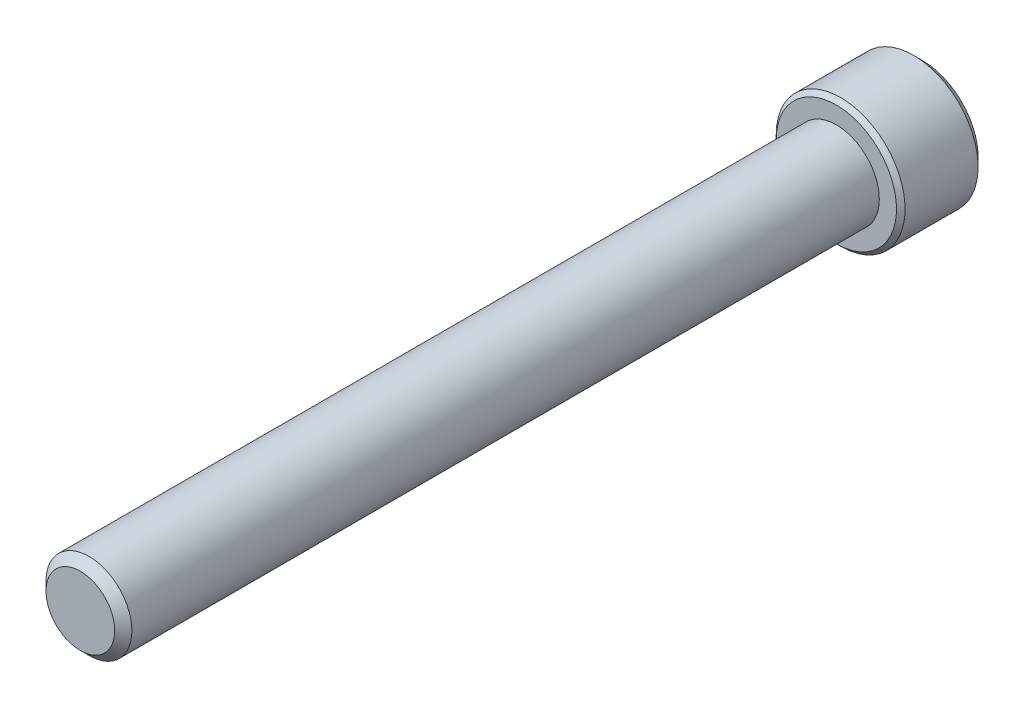
ISO-10303-21;
HEADER;
FILE_DESCRIPTION(('STEP AP214'),'2;1');
FILE_NAME('part.step','',(''),(''),'','','');
FILE_SCHEMA(('AUTOMOTIVE_DESIGN { 1 0 10303 214 1 1 1 1 }'));
ENDSEC;
DATA;
#1=APPLICATION_CONTEXT('core data for automotive mechanical design processes');
#2=APPLICATION_PROTOCOL_DEFINITION('international standard','automotive_design',2000,#1);
#3=PRODUCT_CONTEXT('',#1,'mechanical');
#4=PRODUCT('Part','Part','',(#3));
#5=PRODUCT_RELATED_PRODUCT_CATEGORY('part','',(#4));
#6=PRODUCT_DEFINITION_FORMATION('','',#4);
#7=PRODUCT_DEFINITION_CONTEXT('part definition',#1,'design');
#8=PRODUCT_DEFINITION('design','',#6,#7);
#9=PRODUCT_DEFINITION_SHAPE('','',#8);
#10=(LENGTH_UNIT() NAMED_UNIT(*) SI_UNIT(.MILLI.,.METRE.));
#11=(NAMED_UNIT(*) PLANE_ANGLE_UNIT() SI_UNIT($,.RADIAN.));
#12=(NAMED_UNIT(*) SI_UNIT($,.STERADIAN.) SOLID_ANGLE_UNIT());
#13=UNCERTAINTY_MEASURE_WITH_UNIT(LENGTH_MEASURE(1.E-05),#10,'distance_accuracy_value','');
#14=(GEOMETRIC_REPRESENTATION_CONTEXT(3) GLOBAL_UNCERTAINTY_ASSIGNED_CONTEXT((#13)) GLOBAL_UNIT_ASSIGNED_CONTEXT((#10,
#11,#12)) REPRESENTATION_CONTEXT('',''));
#15=CARTESIAN_POINT('',(0.,0.,0.));
#16=DIRECTION('',(0.,0.,1.));
#17=DIRECTION('',(1.,0.,0.));
#18=AXIS2_PLACEMENT_3D('',#15,#16,#17);
#19=CARTESIAN_POINT('',(0.,0.,-69.85));
#20=DIRECTION('',(0.,0.,1.));
#21=DIRECTION('',(1.,0.,0.));
#22=AXIS2_PLACEMENT_3D('',#19,#20,#21);
#23=CYLINDRICAL_SURFACE('',#22,3.96875);
#24=CARTESIAN_POINT('',(0.,0.,-69.85));
#25=DIRECTION('',(0.,0.,-1.));
#26=DIRECTION('',(-1.,0.,0.));
#27=AXIS2_PLACEMENT_3D('',#24,#25,#26);
#28=CIRCLE('',#27,3.96875);
#29=CARTESIAN_POINT('',(-3.96875,0.,-69.85));
#30=VERTEX_POINT('',#29);
#31=EDGE_CURVE('E212',#30,#30,#28,.F.);
#32=ORIENTED_EDGE('',*,*,#31,.T.);
#33=EDGE_LOOP('',(#32));
#34=FACE_BOUND('',#33,.T.);
#35=CARTESIAN_POINT('',(0.,0.,-0.793749999999996));
#36=DIRECTION('',(0.,0.,1.));
#37=DIRECTION('',(1.,0.,0.));
#38=AXIS2_PLACEMENT_3D('',#35,#36,#37);
#39=CIRCLE('',#38,3.96875);
#40=CARTESIAN_POINT('',(3.96875,0.,-0.793749999999996));
#41=VERTEX_POINT('',#40);
#42=EDGE_CURVE('E108',#41,#41,#39,.F.);
#43=ORIENTED_EDGE('',*,*,#42,.T.);
#44=EDGE_LOOP('',(#43));
#45=FACE_BOUND('',#44,.T.);
#46=ADVANCED_FACE('F34',(#34,#45),#23,.T.);
#47=CARTESIAN_POINT('',(0.,0.,0.));
#48=DIRECTION('',(0.,0.,1.));
#49=DIRECTION('',(1.,0.,0.));
#50=AXIS2_PLACEMENT_3D('',#47,#48,#49);
#51=PLANE('',#50);
#52=CARTESIAN_POINT('',(0.,0.,0.));
#53=DIRECTION('',(0.,0.,1.));
#54=DIRECTION('',(1.,0.,0.));
#55=AXIS2_PLACEMENT_3D('',#52,#53,#54);
#56=CIRCLE('',#55,3.175);
#57=CARTESIAN_POINT('',(3.175,0.,0.));
#58=VERTEX_POINT('',#57);
#59=EDGE_CURVE('E211',#58,#58,#56,.T.);
#60=ORIENTED_EDGE('',*,*,#59,.T.);
#61=EDGE_LOOP('',(#60));
#62=FACE_BOUND('',#61,.T.);
#63=ADVANCED_FACE('F188',(#62),#51,.T.);
#64=CARTESIAN_POINT('',(0.,0.,0.));
#65=DIRECTION('',(0.,0.,-1.));
#66=DIRECTION('',(-1.,0.,0.));
#67=AXIS2_PLACEMENT_3D('',#64,#65,#66);
#68=CONICAL_SURFACE('',#67,3.175,0.785398163397453);
#69=ORIENTED_EDGE('',*,*,#42,.F.);
#70=EDGE_LOOP('',(#69));
#71=FACE_BOUND('',#70,.T.);
#72=ORIENTED_EDGE('',*,*,#59,.F.);
#73=EDGE_LOOP('',(#72));
#74=FACE_BOUND('',#73,.T.);
#75=ADVANCED_FACE('F194',(#71,#74),#68,.T.);
#76=CARTESIAN_POINT('',(0.,0.,-77.7875));
#77=DIRECTION('',(0.,0.,1.));
#78=DIRECTION('',(1.,0.,0.));
#79=AXIS2_PLACEMENT_3D('',#76,#77,#78);
#80=CYLINDRICAL_SURFACE('',#79,5.953125);
#81=CARTESIAN_POINT('',(0.,0.,-70.246875));
#82=DIRECTION('',(0.,0.,-1.));
#83=DIRECTION('',(-1.,0.,0.));
#84=AXIS2_PLACEMENT_3D('',#81,#82,#83);
#85=CIRCLE('',#84,5.953125);
#86=CARTESIAN_POINT('',(-5.95312499999999,0.,-70.246875));
#87=VERTEX_POINT('',#86);
#88=EDGE_CURVE('E42',#87,#87,#85,.T.);
#89=ORIENTED_EDGE('',*,*,#88,.T.);
#90=EDGE_LOOP('',(#89));
#91=FACE_BOUND('',#90,.T.);
#92=CARTESIAN_POINT('',(0.,0.,-76.99375));
#93=DIRECTION('',(0.,0.,-1.));
#94=DIRECTION('',(-1.,0.,0.));
#95=AXIS2_PLACEMENT_3D('',#92,#93,#94);
#96=CIRCLE('',#95,5.953125);
#97=CARTESIAN_POINT('',(-5.953125,0.,-76.99375));
#98=VERTEX_POINT('',#97);
#99=EDGE_CURVE('E171',#98,#98,#96,.F.);
#100=ORIENTED_EDGE('',*,*,#99,.T.);
#101=EDGE_LOOP('',(#100));
#102=FACE_BOUND('',#101,.T.);
#103=ADVANCED_FACE('F176',(#91,#102),#80,.T.);
#104=CARTESIAN_POINT('',(0.,0.,-77.7875));
#105=DIRECTION('',(0.,0.,-1.));
#106=DIRECTION('',(-1.,0.,0.));
#107=AXIS2_PLACEMENT_3D('',#104,#105,#106);
#108=PLANE('',#107);
#109=CARTESIAN_POINT('',(0.,0.,-77.7875));
#110=DIRECTION('',(0.,0.,-1.));
#111=DIRECTION('',(-1.,0.,0.));
#112=AXIS2_PLACEMENT_3D('',#109,#110,#111);
#113=CIRCLE('',#112,5.15937499999999);
#114=CARTESIAN_POINT('',(-5.15937499999999,0.,-77.7875));
#115=VERTEX_POINT('',#114);
#116=EDGE_CURVE('E107',#115,#115,#113,.T.);
#117=ORIENTED_EDGE('',*,*,#116,.T.);
#118=EDGE_LOOP('',(#117));
#119=FACE_BOUND('',#118,.T.);
#120=CARTESIAN_POINT('',(0.,0.,-77.7875));
#121=DIRECTION('',(0.,0.,-1.));
#122=DIRECTION('',(-1.,0.,0.));
#123=AXIS2_PLACEMENT_3D('',#120,#121,#122);
#124=CIRCLE('',#123,3.66617420935412);
#125=CARTESIAN_POINT('',(-3.175,1.83308710467706,-77.7875));
#126=VERTEX_POINT('',#125);
#127=CARTESIAN_POINT('',(0.,3.66617420935412,-77.7875));
#128=VERTEX_POINT('',#127);
#129=EDGE_CURVE('E88',#126,#128,#124,.T.);
#130=ORIENTED_EDGE('',*,*,#129,.F.);
#131=CARTESIAN_POINT('',(-3.175,-1.83308710467706,-77.7875));
#132=VERTEX_POINT('',#131);
#133=EDGE_CURVE('E48',#132,#126,#124,.T.);
#134=ORIENTED_EDGE('',*,*,#133,.F.);
#135=CARTESIAN_POINT('',(0.,-3.66617420935412,-77.7875));
#136=VERTEX_POINT('',#135);
#137=EDGE_CURVE('E270',#136,#132,#124,.T.);
#138=ORIENTED_EDGE('',*,*,#137,.F.);
#139=CARTESIAN_POINT('',(3.175,-1.83308710467706,-77.7875));
#140=VERTEX_POINT('',#139);
#141=EDGE_CURVE('E55',#140,#136,#124,.T.);
#142=ORIENTED_EDGE('',*,*,#141,.F.);
#143=CARTESIAN_POINT('',(3.175,1.83308710467706,-77.7875));
#144=VERTEX_POINT('',#143);
#145=EDGE_CURVE('E129',#144,#140,#124,.T.);
#146=ORIENTED_EDGE('',*,*,#145,.F.);
#147=EDGE_CURVE('E97',#128,#144,#124,.T.);
#148=ORIENTED_EDGE('',*,*,#147,.F.);
#149=EDGE_LOOP('',(#130,#134,#138,#142,#146,#148));
#150=FACE_BOUND('',#149,.T.);
#151=ADVANCED_FACE('F128',(#119,#150),#108,.T.);
#152=CARTESIAN_POINT('',(0.,0.,-69.85));
#153=DIRECTION('',(0.,0.,-1.));
#154=DIRECTION('',(-1.,0.,0.));
#155=AXIS2_PLACEMENT_3D('',#152,#153,#154);
#156=PLANE('',#155);
#157=CARTESIAN_POINT('',(0.,0.,-69.85));
#158=DIRECTION('',(0.,0.,-1.));
#159=DIRECTION('',(-1.,0.,0.));
#160=AXIS2_PLACEMENT_3D('',#157,#158,#159);
#161=CIRCLE('',#160,5.55625000000001);
#162=CARTESIAN_POINT('',(-5.55625000000001,0.,-69.85));
#163=VERTEX_POINT('',#162);
#164=EDGE_CURVE('E11',#163,#163,#161,.F.);
#165=ORIENTED_EDGE('',*,*,#164,.T.);
#166=EDGE_LOOP('',(#165));
#167=FACE_BOUND('',#166,.T.);
#168=ORIENTED_EDGE('',*,*,#31,.F.);
#169=EDGE_LOOP('',(#168));
#170=FACE_BOUND('',#169,.T.);
#171=ADVANCED_FACE('F282',(#167,#170),#156,.F.);
#172=CARTESIAN_POINT('',(0.,0.,-77.7875));
#173=DIRECTION('',(0.,0.,-1.));
#174=DIRECTION('',(-1.,0.,0.));
#175=AXIS2_PLACEMENT_3D('',#172,#173,#174);
#176=CONICAL_SURFACE('',#175,3.66617420935412,0.78539816339745);
#177=ORIENTED_EDGE('',*,*,#147,.T.);
#178=CARTESIAN_POINT('',(-0.000200000000000587,3.66628967940796,-77.7876154755089));
#179=CARTESIAN_POINT('',(0.108938349949823,3.60327862368552,-77.7246589836918));
#180=CARTESIAN_POINT('',(0.21990162807794,3.53921394518809,-77.6654001042347));
#181=CARTESIAN_POINT('',(0.44616784634594,3.40857908316254,-77.5568986557305));
#182=CARTESIAN_POINT('',(0.561492303252257,3.34199647692353,-77.5077164539387));
#183=CARTESIAN_POINT('',(0.79403852248062,3.207735854653,-77.423466458874));
#184=CARTESIAN_POINT('',(0.911201066281143,3.14009202845083,-77.3881869144994));
#185=CARTESIAN_POINT('',(1.14810544464627,3.00331522182952,-77.3338315701348));
#186=CARTESIAN_POINT('',(1.26784004264354,2.93418641944449,-77.3147151975296));
#187=CARTESIAN_POINT('',(1.47419791875157,2.81504564412412,-77.2974671306232));
#188=CARTESIAN_POINT('',(1.56055470772915,2.76518752876156,-77.2949139336138));
#189=CARTESIAN_POINT('',(1.73312781652471,2.66555239794355,-77.2992162731232));
#190=CARTESIAN_POINT('',(1.81934407649279,2.61577541704246,-77.3060751080214));
#191=CARTESIAN_POINT('',(1.99095979158712,2.51669303773558,-77.3288098833037));
#192=CARTESIAN_POINT('',(2.07635822425327,2.46738822964741,-77.3446959096873));
#193=CARTESIAN_POINT('',(2.24568840330547,2.36962540518969,-77.384617983998));
#194=CARTESIAN_POINT('',(2.32962026161974,2.32116732419836,-77.4086534070852));
#195=CARTESIAN_POINT('',(2.47862357928411,2.23514021863469,-77.4581052344172));
#196=CARTESIAN_POINT('',(2.54402485119173,2.19738077669348,-77.482221719301));
#197=CARTESIAN_POINT('',(2.6736532502051,2.12253978562849,-77.5343414671371));
#198=CARTESIAN_POINT('',(2.73788034144172,2.08545825721376,-77.5623448486035));
#199=CARTESIAN_POINT('',(2.8649580345126,2.01208991691129,-77.6216105655445));
#200=CARTESIAN_POINT('',(2.92781225074872,1.97580101824767,-77.6528626533542));
#201=CARTESIAN_POINT('',(3.05235662084809,1.90389529264474,-77.7182153443919));
#202=CARTESIAN_POINT('',(3.11404746097871,1.8682780694888,-77.7523141995185));
#203=CARTESIAN_POINT('',(3.1752,1.83297163462322,-77.7876154755089));
#204=B_SPLINE_CURVE_WITH_KNOTS('',3,(#178,#179,#180,#181,#182,#183,#184,#185,#186,#187,#188,
#189,#190,#191,#192,#193,#194,#195,#196,#197,#198,#199,#200,#201,#202,#203),.UNSPECIFIED.,.F.,
.F.,(4,2,2,2,2,2,2,2,2,2,2,2,4),(0.,0.4229105724368,0.848285055427804,1.26690402276126,
1.68446903107505,1.98329272958351,2.28222117546889,2.58148426995465,2.88072442418451,
3.11844134429546,3.35616551414404,3.59316134346766,3.8300126974443),.UNSPECIFIED.);
#205=EDGE_CURVE('E102',#128,#144,#204,.T.);
#206=ORIENTED_EDGE('',*,*,#205,.F.);
#207=EDGE_LOOP('',(#177,#206));
#208=FACE_BOUND('',#207,.T.);
#209=ADVANCED_FACE('F103',(#208),#176,.F.);
#210=ORIENTED_EDGE('',*,*,#145,.T.);
#211=CARTESIAN_POINT('',(3.175,-3.70444383584786,-79.0002118451619));
#212=CARTESIAN_POINT('',(3.175,-3.61446006856655,-78.9319043948676));
#213=CARTESIAN_POINT('',(3.175,-3.52397795214463,-78.8642428612444));
#214=CARTESIAN_POINT('',(3.175,-3.34181836123848,-78.7305025492024));
#215=CARTESIAN_POINT('',(3.175,-3.25014059728401,-78.6644241654826));
#216=CARTESIAN_POINT('',(3.175,-3.06472035593929,-78.5336709408018));
#217=CARTESIAN_POINT('',(3.175,-2.97096738900307,-78.4690109250879));
#218=CARTESIAN_POINT('',(3.175,-2.78187869931256,-78.3420558022517));
#219=CARTESIAN_POINT('',(3.175,-2.68654308817008,-78.279760529372));
#220=CARTESIAN_POINT('',(3.175,-2.48836016870252,-78.1544784446062));
#221=CARTESIAN_POINT('',(3.175,-2.38540128536647,-78.0916672392123));
#222=CARTESIAN_POINT('',(3.175,-2.17707529026742,-77.9701078544743));
#223=CARTESIAN_POINT('',(3.175,-2.07170779370642,-77.911360330462));
#224=CARTESIAN_POINT('',(3.175,-1.85856318748113,-77.7991912176541));
#225=CARTESIAN_POINT('',(3.175,-1.75079438294671,-77.7457539709329));
#226=CARTESIAN_POINT('',(3.175,-1.53228582600746,-77.6454020450525));
#227=CARTESIAN_POINT('',(3.175,-1.4215474633634,-77.5984843761431));
#228=CARTESIAN_POINT('',(3.175,-1.20656057350992,-77.516530034464));
#229=CARTESIAN_POINT('',(3.175,-1.10257181507286,-77.4808189415949));
#230=CARTESIAN_POINT('',(3.175,-0.892048260878874,-77.4177329725217));
#231=CARTESIAN_POINT('',(3.175,-0.785513294311067,-77.3903586572879));
#232=CARTESIAN_POINT('',(3.175,-0.572329012717395,-77.3458460023287));
#233=CARTESIAN_POINT('',(3.175,-0.465717564636555,-77.3285292889145));
#234=CARTESIAN_POINT('',(3.175,-0.251301383583118,-77.3044756602937));
#235=CARTESIAN_POINT('',(3.175,-0.143496870917766,-77.2977368235873));
#236=CARTESIAN_POINT('',(3.175,0.0681069951827616,-77.2953609564692));
#237=CARTESIAN_POINT('',(3.175,0.171901813638649,-77.2993091223896));
#238=CARTESIAN_POINT('',(3.175,0.378625872879033,-77.3171624071181));
#239=CARTESIAN_POINT('',(3.175,0.481555030095565,-77.3310684763143));
#240=CARTESIAN_POINT('',(3.175,0.687543944903113,-77.3683074222191));
#241=CARTESIAN_POINT('',(3.175,0.790573911747977,-77.3918024293294));
#242=CARTESIAN_POINT('',(3.175,0.994382635323689,-77.4469517792585));
#243=CARTESIAN_POINT('',(3.175,1.09516156281328,-77.4786055008759));
#244=CARTESIAN_POINT('',(3.175,1.30251417649916,-77.5516294931737));
#245=CARTESIAN_POINT('',(3.175,1.40887912364162,-77.5935863005657));
#246=CARTESIAN_POINT('',(3.175,1.61884111284847,-77.6839490627203));
#247=CARTESIAN_POINT('',(3.175,1.72243722600422,-77.7323571499939));
#248=CARTESIAN_POINT('',(3.175,1.92738358083042,-77.8344798355874));
#249=CARTESIAN_POINT('',(3.175,2.02872533588121,-77.888211328075));
#250=CARTESIAN_POINT('',(3.175,2.22907994672306,-77.9997921629552));
#251=CARTESIAN_POINT('',(3.175,2.32809316592037,-78.0576408570403));
#252=CARTESIAN_POINT('',(3.175,2.51923503723042,-78.1736949409625));
#253=CARTESIAN_POINT('',(3.175,2.61146147877824,-78.2317401210939));
#254=CARTESIAN_POINT('',(3.175,2.79433061473593,-78.350281230002));
#255=CARTESIAN_POINT('',(3.175,2.88497318880336,-78.410777343852));
#256=CARTESIAN_POINT('',(3.175,3.06414875022217,-78.5332851399095));
#257=CARTESIAN_POINT('',(3.175,3.15269287411231,-78.5952805926272));
#258=CARTESIAN_POINT('',(3.175,3.32856950185137,-78.7209183631728));
#259=CARTESIAN_POINT('',(3.175,3.41590233249718,-78.7845602229942));
#260=CARTESIAN_POINT('',(3.175,3.50272764399219,-78.8488754675913));
#261=B_SPLINE_CURVE_WITH_KNOTS('',3,(#211,#212,#213,#214,#215,#216,#217,#218,#219,#220,#221,
#222,#223,#224,#225,#226,#227,#228,#229,#230,#231,#232,#233,#234,#235,#236,#237,#238,#239,#240,
#241,#242,#243,#244,#245,#246,#247,#248,#249,#250,#251,#252,#253,#254,#255,#256,#257,#258,#259,
#260),.UNSPECIFIED.,.F.,.F.,(4,2,2,2,2,2,2,2,2,2,2,2,2,2,2,2,2,2,2,2,2,2,2,2,4),(0.,
0.338926722917922,0.677937083279506,1.01957183491539,1.36118259515686,1.72292567400707,
2.08472695420016,2.44542763005297,2.8059623458982,3.13552343983682,3.46510670458908,
3.78865064563719,4.11213580725538,4.42324708341663,4.73438805617944,5.05102342839299,
5.36763469922675,5.71039210015347,6.05326308403166,6.39725934486604,6.74120155829906,
7.0680729247469,7.39496901986436,7.71921932182544,8.04338037199422),.UNSPECIFIED.);
#262=EDGE_CURVE('E96',#144,#140,#261,.F.);
#263=ORIENTED_EDGE('',*,*,#262,.F.);
#264=EDGE_LOOP('',(#210,#263));
#265=FACE_BOUND('',#264,.T.);
#266=ADVANCED_FACE('F276',(#265),#176,.F.);
#267=ORIENTED_EDGE('',*,*,#141,.T.);
#268=CARTESIAN_POINT('',(3.1752,-1.83297163462322,-77.7876154755089));
#269=CARTESIAN_POINT('',(3.06606165005018,-1.89598269034567,-77.7246589836918));
#270=CARTESIAN_POINT('',(2.95509837192206,-1.9600473688431,-77.6654001042347));
#271=CARTESIAN_POINT('',(2.72883215365406,-2.09068223086865,-77.5568986557305));
#272=CARTESIAN_POINT('',(2.61350769674774,-2.15726483710766,-77.5077164539387));
#273=CARTESIAN_POINT('',(2.38096147751938,-2.29152545937818,-77.423466458874));
#274=CARTESIAN_POINT('',(2.26379893371886,-2.35916928558035,-77.3881869144994));
#275=CARTESIAN_POINT('',(2.02689455535373,-2.49594609220166,-77.3338315701348));
#276=CARTESIAN_POINT('',(1.90715995735646,-2.5650748945867,-77.3147151975296));
#277=CARTESIAN_POINT('',(1.70080208124843,-2.68421566990707,-77.2974671306232));
#278=CARTESIAN_POINT('',(1.61444529227086,-2.73407378526962,-77.2949139336138));
#279=CARTESIAN_POINT('',(1.44187218347529,-2.83370891608763,-77.2992162731232));
#280=CARTESIAN_POINT('',(1.35565592350721,-2.88348589698873,-77.3060751080214));
#281=CARTESIAN_POINT('',(1.18404020841288,-2.98256827629561,-77.3288098833037));
#282=CARTESIAN_POINT('',(1.09864177574673,-3.03187308438378,-77.3446959096873));
#283=CARTESIAN_POINT('',(0.929311596694532,-3.12963590884149,-77.384617983998));
#284=CARTESIAN_POINT('',(0.84537973838026,-3.17809398983283,-77.4086534070852));
#285=CARTESIAN_POINT('',(0.696376420715892,-3.26412109539649,-77.4581052344172));
#286=CARTESIAN_POINT('',(0.630975148808273,-3.3018805373377,-77.482221719301));
#287=CARTESIAN_POINT('',(0.501346749794896,-3.3767215284027,-77.5343414671371));
#288=CARTESIAN_POINT('',(0.43711965855828,-3.41380305681742,-77.5623448486035));
#289=CARTESIAN_POINT('',(0.310041965487404,-3.48717139711989,-77.6216105655445));
#290=CARTESIAN_POINT('',(0.247187749251281,-3.52346029578352,-77.6528626533542));
#291=CARTESIAN_POINT('',(0.122643379151911,-3.59536602138644,-77.7182153443919));
#292=CARTESIAN_POINT('',(0.0609525390212932,-3.63098324454239,-77.7523141995185));
#293=CARTESIAN_POINT('',(-0.000200000000001268,-3.66628967940796,-77.7876154755089));
#294=B_SPLINE_CURVE_WITH_KNOTS('',3,(#268,#269,#270,#271,#272,#273,#274,#275,#276,#277,#278,
#279,#280,#281,#282,#283,#284,#285,#286,#287,#288,#289,#290,#291,#292,#293),.UNSPECIFIED.,.F.,
.F.,(4,2,2,2,2,2,2,2,2,2,2,2,4),(0.,0.422910572436801,0.848285055427804,1.26690402276126,
1.68446903107505,1.98329272958351,2.28222117546889,2.58148426995465,2.88072442418451,
3.11844134429546,3.35616551414404,3.59316134346766,3.8300126974443),.UNSPECIFIED.);
#295=EDGE_CURVE('E139',#140,#136,#294,.T.);
#296=ORIENTED_EDGE('',*,*,#295,.F.);
#297=EDGE_LOOP('',(#267,#296));
#298=FACE_BOUND('',#297,.T.);
#299=ADVANCED_FACE('F273',(#298),#176,.F.);
#300=ORIENTED_EDGE('',*,*,#137,.T.);
#301=CARTESIAN_POINT('',(0.000200000000000726,-3.66628967940796,-77.7876154755089));
#302=CARTESIAN_POINT('',(-0.108938349949823,-3.60327862368552,-77.7246589836918));
#303=CARTESIAN_POINT('',(-0.21990162807794,-3.53921394518809,-77.6654001042347));
#304=CARTESIAN_POINT('',(-0.44616784634594,-3.40857908316254,-77.5568986557305));
#305=CARTESIAN_POINT('',(-0.561492303252257,-3.34199647692353,-77.5077164539387));
#306=CARTESIAN_POINT('',(-0.79403852248062,-3.20773585465301,-77.423466458874));
#307=CARTESIAN_POINT('',(-0.911201066281143,-3.14009202845083,-77.3881869144994));
#308=CARTESIAN_POINT('',(-1.14810544464627,-3.00331522182952,-77.3338315701348));
#309=CARTESIAN_POINT('',(-1.26784004264354,-2.93418641944449,-77.3147151975296));
#310=CARTESIAN_POINT('',(-1.47419791875157,-2.81504564412412,-77.2974671306232));
#311=CARTESIAN_POINT('',(-1.56055470772915,-2.76518752876156,-77.2949139336138));
#312=CARTESIAN_POINT('',(-1.73312781652471,-2.66555239794356,-77.2992162731232));
#313=CARTESIAN_POINT('',(-1.81934407649279,-2.61577541704246,-77.3060751080214));
#314=CARTESIAN_POINT('',(-1.99095979158712,-2.51669303773558,-77.3288098833037));
#315=CARTESIAN_POINT('',(-2.07635822425326,-2.46738822964741,-77.3446959096873));
#316=CARTESIAN_POINT('',(-2.24568840330546,-2.36962540518969,-77.384617983998));
#317=CARTESIAN_POINT('',(-2.32962026161974,-2.32116732419836,-77.4086534070852));
#318=CARTESIAN_POINT('',(-2.47862357928411,-2.23514021863469,-77.4581052344172));
#319=CARTESIAN_POINT('',(-2.54402485119173,-2.19738077669348,-77.482221719301));
#320=CARTESIAN_POINT('',(-2.6736532502051,-2.12253978562849,-77.5343414671371));
#321=CARTESIAN_POINT('',(-2.73788034144172,-2.08545825721376,-77.5623448486035));
#322=CARTESIAN_POINT('',(-2.8649580345126,-2.0120899169113,-77.6216105655445));
#323=CARTESIAN_POINT('',(-2.92781225074872,-1.97580101824767,-77.6528626533542));
#324=CARTESIAN_POINT('',(-3.05235662084809,-1.90389529264474,-77.7182153443919));
#325=CARTESIAN_POINT('',(-3.11404746097871,-1.8682780694888,-77.7523141995185));
#326=CARTESIAN_POINT('',(-3.1752,-1.83297163462322,-77.7876154755089));
#327=B_SPLINE_CURVE_WITH_KNOTS('',3,(#301,#302,#303,#304,#305,#306,#307,#308,#309,#310,#311,
#312,#313,#314,#315,#316,#317,#318,#319,#320,#321,#322,#323,#324,#325,#326),.UNSPECIFIED.,.F.,
.F.,(4,2,2,2,2,2,2,2,2,2,2,2,4),(0.,0.422910572436801,0.848285055427804,1.26690402276126,
1.68446903107505,1.98329272958351,2.28222117546889,2.58148426995465,2.88072442418451,
3.11844134429545,3.35616551414404,3.59316134346766,3.8300126974443),.UNSPECIFIED.);
#328=EDGE_CURVE('E247',#136,#132,#327,.T.);
#329=ORIENTED_EDGE('',*,*,#328,.F.);
#330=EDGE_LOOP('',(#300,#329));
#331=FACE_BOUND('',#330,.T.);
#332=ADVANCED_FACE('F272',(#331),#176,.F.);
#333=ORIENTED_EDGE('',*,*,#133,.T.);
#334=CARTESIAN_POINT('',(-3.175,-3.70444383603083,-79.0002118453008));
#335=CARTESIAN_POINT('',(-3.175,-3.61446006874434,-78.9319043950011));
#336=CARTESIAN_POINT('',(-3.175,-3.52397795231724,-78.8642428613727));
#337=CARTESIAN_POINT('',(-3.175,-3.34181836140065,-78.73050254932));
#338=CARTESIAN_POINT('',(-3.175,-3.25014059744092,-78.6644241655949));
#339=CARTESIAN_POINT('',(-3.175,-3.06472035608554,-78.5336709409034));
#340=CARTESIAN_POINT('',(-3.175,-2.9709673891439,-78.4690109251841));
#341=CARTESIAN_POINT('',(-3.175,-2.78187869944245,-78.3420558023373));
#342=CARTESIAN_POINT('',(-3.175,-2.68654308829445,-78.2797605294523));
#343=CARTESIAN_POINT('',(-3.175,-2.48836016881499,-78.1544784446755));
#344=CARTESIAN_POINT('',(-3.175,-2.38540128547254,-78.0916672392759));
#345=CARTESIAN_POINT('',(-3.175,-2.17707529036045,-77.9701078545268));
#346=CARTESIAN_POINT('',(-3.175,-2.07170779379281,-77.9113603305091));
#347=CARTESIAN_POINT('',(-3.175,-1.85856318755402,-77.7991912176908));
#348=CARTESIAN_POINT('',(-3.175,-1.75079438301273,-77.7457539709646));
#349=CARTESIAN_POINT('',(-3.175,-1.53228582605937,-77.6454020450749));
#350=CARTESIAN_POINT('',(-3.175,-1.42154746340806,-77.5984843761612));
#351=CARTESIAN_POINT('',(-3.175,-1.20656057355149,-77.5165300344789));
#352=CARTESIAN_POINT('',(-3.175,-1.1025718151189,-77.4808189416102));
#353=CARTESIAN_POINT('',(-3.175,-0.892048260933987,-77.4177329725368));
#354=CARTESIAN_POINT('',(-3.175,-0.785513294370796,-77.3903586573024));
#355=CARTESIAN_POINT('',(-3.175,-0.572329012786208,-77.3458460023411));
#356=CARTESIAN_POINT('',(-3.175,-0.465717564709834,-77.3285292889254));
#357=CARTESIAN_POINT('',(-3.175,-0.251301383665187,-77.3044756603003));
#358=CARTESIAN_POINT('',(-3.175,-0.14349687100416,-77.2977368235913));
#359=CARTESIAN_POINT('',(-3.175,0.0681069950885741,-77.2953609564672));
#360=CARTESIAN_POINT('',(-3.175,0.171901813540982,-77.2993091223844));
#361=CARTESIAN_POINT('',(-3.175,0.378625872774766,-77.3171624071059));
#362=CARTESIAN_POINT('',(-3.175,0.481555029988177,-77.3310684762983));
#363=CARTESIAN_POINT('',(-3.175,0.687543944789566,-77.3683074221952));
#364=CARTESIAN_POINT('',(-3.175,0.790573911631403,-77.3918024293013));
#365=CARTESIAN_POINT('',(-3.175,0.994382635201358,-77.446951779222));
#366=CARTESIAN_POINT('',(-3.175,1.09516156268822,-77.4786055008352));
#367=CARTESIAN_POINT('',(-3.175,1.30251417635927,-77.5516294931208));
#368=CARTESIAN_POINT('',(-3.175,1.40887912348989,-77.5935863005044));
#369=CARTESIAN_POINT('',(-3.175,1.61884111267367,-77.6839490626411));
#370=CARTESIAN_POINT('',(-3.175,1.72243722581818,-77.7323571499053));
#371=CARTESIAN_POINT('',(-3.175,1.92738358062232,-77.8344798354796));
#372=CARTESIAN_POINT('',(-3.175,2.02872533566228,-77.8882113279572));
#373=CARTESIAN_POINT('',(-3.175,2.22907994648283,-77.9997921628173));
#374=CARTESIAN_POINT('',(-3.175,2.32809316566967,-78.0576408568921));
#375=CARTESIAN_POINT('',(-3.175,2.51923503696069,-78.1736949407949));
#376=CARTESIAN_POINT('',(-3.175,2.61146147849992,-78.2317401209172));
#377=CARTESIAN_POINT('',(-3.175,2.79433061444055,-78.3502812298069));
#378=CARTESIAN_POINT('',(-3.175,2.88497318849952,-78.4107773436477));
#379=CARTESIAN_POINT('',(-3.175,3.0641487499016,-78.5332851396869));
#380=CARTESIAN_POINT('',(-3.175,3.15269287378348,-78.5952805923955));
#381=CARTESIAN_POINT('',(-3.175,3.32856950150606,-78.7209183629229));
#382=CARTESIAN_POINT('',(-3.175,3.41590233214366,-78.7845602227352));
#383=CARTESIAN_POINT('',(-3.175,3.50272764363047,-78.8488754673233));
#384=B_SPLINE_CURVE_WITH_KNOTS('',3,(#334,#335,#336,#337,#338,#339,#340,#341,#342,#343,#344,
#345,#346,#347,#348,#349,#350,#351,#352,#353,#354,#355,#356,#357,#358,#359,#360,#361,#362,#363,
#364,#365,#366,#367,#368,#369,#370,#371,#372,#373,#374,#375,#376,#377,#378,#379,#380,#381,#382,
#383),.UNSPECIFIED.,.F.,.F.,(4,2,2,2,2,2,2,2,2,2,2,2,2,2,2,2,2,2,2,2,2,2,2,2,4),(0.,
0.338926722940012,0.677937083323705,1.01957183498209,1.36118259524607,1.72292567412156,
2.08472695433994,2.44542763021783,2.80596234608809,3.13552344001375,3.46510670475308,
3.7886506457888,4.1121358073946,4.42324708354509,4.73438805629712,5.05102342849904,
5.36763469932117,5.71039210020556,6.05326308404134,6.39725934483308,6.74120155822349,
7.06807292463489,7.39496901971591,7.71921932164103,8.04338037177385),.UNSPECIFIED.);
#385=EDGE_CURVE('E118',#132,#126,#384,.T.);
#386=ORIENTED_EDGE('',*,*,#385,.F.);
#387=EDGE_LOOP('',(#333,#386));
#388=FACE_BOUND('',#387,.T.);
#389=ADVANCED_FACE('F289',(#388),#176,.F.);
#390=ORIENTED_EDGE('',*,*,#129,.T.);
#391=CARTESIAN_POINT('',(-3.1752,1.83297163462322,-77.7876154755089));
#392=CARTESIAN_POINT('',(-3.06606165005018,1.89598269034567,-77.7246589836918));
#393=CARTESIAN_POINT('',(-2.95509837192206,1.9600473688431,-77.6654001042347));
#394=CARTESIAN_POINT('',(-2.72883215365406,2.09068223086864,-77.5568986557305));
#395=CARTESIAN_POINT('',(-2.61350769674775,2.15726483710765,-77.5077164539387));
#396=CARTESIAN_POINT('',(-2.38096147751938,2.29152545937818,-77.423466458874));
#397=CARTESIAN_POINT('',(-2.26379893371886,2.35916928558035,-77.3881869144994));
#398=CARTESIAN_POINT('',(-2.02689455535373,2.49594609220166,-77.3338315701348));
#399=CARTESIAN_POINT('',(-1.90715995735646,2.5650748945867,-77.3147151975296));
#400=CARTESIAN_POINT('',(-1.70080208124843,2.68421566990707,-77.2974671306232));
#401=CARTESIAN_POINT('',(-1.61444529227086,2.73407378526962,-77.2949139336138));
#402=CARTESIAN_POINT('',(-1.4418721834753,2.83370891608763,-77.2992162731232));
#403=CARTESIAN_POINT('',(-1.35565592350721,2.88348589698873,-77.3060751080214));
#404=CARTESIAN_POINT('',(-1.18404020841288,2.9825682762956,-77.3288098833037));
#405=CARTESIAN_POINT('',(-1.09864177574674,3.03187308438377,-77.3446959096873));
#406=CARTESIAN_POINT('',(-0.929311596694538,3.12963590884149,-77.3846179839979));
#407=CARTESIAN_POINT('',(-0.845379738380262,3.17809398983282,-77.4086534070852));
#408=CARTESIAN_POINT('',(-0.696376420715895,3.26412109539649,-77.4581052344171));
#409=CARTESIAN_POINT('',(-0.630975148808279,3.3018805373377,-77.482221719301));
#410=CARTESIAN_POINT('',(-0.501346749794902,3.37672152840269,-77.5343414671371));
#411=CARTESIAN_POINT('',(-0.437119658558282,3.41380305681742,-77.5623448486035));
#412=CARTESIAN_POINT('',(-0.310041965487401,3.48717139711989,-77.6216105655445));
#413=CARTESIAN_POINT('',(-0.247187749251277,3.52346029578352,-77.6528626533542));
#414=CARTESIAN_POINT('',(-0.122643379151908,3.59536602138644,-77.7182153443919));
#415=CARTESIAN_POINT('',(-0.0609525390212914,3.63098324454239,-77.7523141995185));
#416=CARTESIAN_POINT('',(0.000200000000001914,3.66628967940796,-77.7876154755089));
#417=B_SPLINE_CURVE_WITH_KNOTS('',3,(#391,#392,#393,#394,#395,#396,#397,#398,#399,#400,#401,
#402,#403,#404,#405,#406,#407,#408,#409,#410,#411,#412,#413,#414,#415,#416),.UNSPECIFIED.,.F.,
.F.,(4,2,2,2,2,2,2,2,2,2,2,2,4),(0.,0.4229105724368,0.8482850554278,1.26690402276126,
1.68446903107505,1.98329272958351,2.28222117546889,2.58148426995465,2.8807244241845,
3.11844134429545,3.35616551414405,3.59316134346767,3.8300126974443),.UNSPECIFIED.);
#418=EDGE_CURVE('E92',#126,#128,#417,.T.);
#419=ORIENTED_EDGE('',*,*,#418,.F.);
#420=EDGE_LOOP('',(#390,#419));
#421=FACE_BOUND('',#420,.T.);
#422=ADVANCED_FACE('F90',(#421),#176,.F.);
#423=CARTESIAN_POINT('',(3.175,5.49926131403118,-73.025));
#424=DIRECTION('',(0.,0.,-1.));
#425=DIRECTION('',(-1.,0.,0.));
#426=AXIS2_PLACEMENT_3D('',#423,#424,#425);
#427=PLANE('',#426);
#428=DIRECTION('',(0.866025403784439,0.5,0.));
#429=VECTOR('',#428,1.);
#430=CARTESIAN_POINT('',(-3.175,1.83308710467706,-73.025));
#431=LINE('',#430,#429);
#432=CARTESIAN_POINT('',(-3.175,1.83308710467706,-73.025));
#433=VERTEX_POINT('',#432);
#434=CARTESIAN_POINT('',(0.,3.66617420935412,-73.025));
#435=VERTEX_POINT('',#434);
#436=EDGE_CURVE('E117',#433,#435,#431,.T.);
#437=ORIENTED_EDGE('',*,*,#436,.T.);
#438=DIRECTION('',(0.866025403784439,-0.5,0.));
#439=VECTOR('',#438,1.);
#440=CARTESIAN_POINT('',(0.,3.66617420935412,-73.025));
#441=LINE('',#440,#439);
#442=CARTESIAN_POINT('',(3.175,1.83308710467706,-73.025));
#443=VERTEX_POINT('',#442);
#444=EDGE_CURVE('E122',#435,#443,#441,.T.);
#445=ORIENTED_EDGE('',*,*,#444,.T.);
#446=DIRECTION('',(0.,-1.,0.));
#447=VECTOR('',#446,1.);
#448=CARTESIAN_POINT('',(3.175,1.83308710467706,-73.025));
#449=LINE('',#448,#447);
#450=CARTESIAN_POINT('',(3.175,-1.83308710467706,-73.025));
#451=VERTEX_POINT('',#450);
#452=EDGE_CURVE('E233',#443,#451,#449,.T.);
#453=ORIENTED_EDGE('',*,*,#452,.T.);
#454=DIRECTION('',(-0.866025403784439,-0.5,0.));
#455=VECTOR('',#454,1.);
#456=CARTESIAN_POINT('',(3.175,-1.83308710467706,-73.025));
#457=LINE('',#456,#455);
#458=CARTESIAN_POINT('',(0.,-3.66617420935412,-73.025));
#459=VERTEX_POINT('',#458);
#460=EDGE_CURVE('E230',#451,#459,#457,.T.);
#461=ORIENTED_EDGE('',*,*,#460,.T.);
#462=DIRECTION('',(-0.866025403784439,0.5,0.));
#463=VECTOR('',#462,1.);
#464=CARTESIAN_POINT('',(0.,-3.66617420935412,-73.025));
#465=LINE('',#464,#463);
#466=CARTESIAN_POINT('',(-3.175,-1.83308710467706,-73.025));
#467=VERTEX_POINT('',#466);
#468=EDGE_CURVE('E227',#459,#467,#465,.T.);
#469=ORIENTED_EDGE('',*,*,#468,.T.);
#470=DIRECTION('',(0.,1.,0.));
#471=VECTOR('',#470,1.);
#472=CARTESIAN_POINT('',(-3.175,-1.83308710467706,-73.025));
#473=LINE('',#472,#471);
#474=EDGE_CURVE('E125',#467,#433,#473,.T.);
#475=ORIENTED_EDGE('',*,*,#474,.T.);
#476=EDGE_LOOP('',(#437,#445,#453,#461,#469,#475));
#477=FACE_BOUND('',#476,.T.);
#478=ADVANCED_FACE('F159',(#477),#427,.T.);
#479=CARTESIAN_POINT('',(0.,3.66617420935412,-73.025));
#480=DIRECTION('',(0.5,0.866025403784439,0.));
#481=DIRECTION('',(-0.866025403784439,0.5,0.));
#482=AXIS2_PLACEMENT_3D('',#479,#480,#481);
#483=PLANE('',#482);
#484=DIRECTION('',(0.,0.,-1.));
#485=VECTOR('',#484,1.);
#486=CARTESIAN_POINT('',(0.,3.66617420935412,-73.025));
#487=LINE('',#486,#485);
#488=EDGE_CURVE('E114',#435,#128,#487,.T.);
#489=ORIENTED_EDGE('',*,*,#488,.T.);
#490=ORIENTED_EDGE('',*,*,#205,.T.);
#491=DIRECTION('',(0.,0.,-1.));
#492=VECTOR('',#491,1.);
#493=CARTESIAN_POINT('',(3.175,1.83308710467706,-73.025));
#494=LINE('',#493,#492);
#495=EDGE_CURVE('E124',#443,#144,#494,.T.);
#496=ORIENTED_EDGE('',*,*,#495,.F.);
#497=ORIENTED_EDGE('',*,*,#444,.F.);
#498=EDGE_LOOP('',(#489,#490,#496,#497));
#499=FACE_BOUND('',#498,.T.);
#500=ADVANCED_FACE('F120',(#499),#483,.F.);
#501=CARTESIAN_POINT('',(3.175,1.83308710467706,-73.025));
#502=DIRECTION('',(1.,0.,0.));
#503=DIRECTION('',(0.,0.,-1.));
#504=AXIS2_PLACEMENT_3D('',#501,#502,#503);
#505=PLANE('',#504);
#506=ORIENTED_EDGE('',*,*,#495,.T.);
#507=ORIENTED_EDGE('',*,*,#262,.T.);
#508=DIRECTION('',(0.,0.,-1.));
#509=VECTOR('',#508,1.);
#510=CARTESIAN_POINT('',(3.175,-1.83308710467706,-73.025));
#511=LINE('',#510,#509);
#512=EDGE_CURVE('E216',#451,#140,#511,.T.);
#513=ORIENTED_EDGE('',*,*,#512,.F.);
#514=ORIENTED_EDGE('',*,*,#452,.F.);
#515=EDGE_LOOP('',(#506,#507,#513,#514));
#516=FACE_BOUND('',#515,.T.);
#517=ADVANCED_FACE('F148',(#516),#505,.F.);
#518=CARTESIAN_POINT('',(3.175,-1.83308710467706,-73.025));
#519=DIRECTION('',(0.5,-0.866025403784439,0.));
#520=DIRECTION('',(0.866025403784439,0.5,0.));
#521=AXIS2_PLACEMENT_3D('',#518,#519,#520);
#522=PLANE('',#521);
#523=ORIENTED_EDGE('',*,*,#512,.T.);
#524=ORIENTED_EDGE('',*,*,#295,.T.);
#525=DIRECTION('',(0.,0.,-1.));
#526=VECTOR('',#525,1.);
#527=CARTESIAN_POINT('',(0.,-3.66617420935412,-73.025));
#528=LINE('',#527,#526);
#529=EDGE_CURVE('E219',#459,#136,#528,.T.);
#530=ORIENTED_EDGE('',*,*,#529,.F.);
#531=ORIENTED_EDGE('',*,*,#460,.F.);
#532=EDGE_LOOP('',(#523,#524,#530,#531));
#533=FACE_BOUND('',#532,.T.);
#534=ADVANCED_FACE('F152',(#533),#522,.F.);
#535=CARTESIAN_POINT('',(0.,-3.66617420935412,-73.025));
#536=DIRECTION('',(-0.5,-0.866025403784439,0.));
#537=DIRECTION('',(0.866025403784439,-0.5,0.));
#538=AXIS2_PLACEMENT_3D('',#535,#536,#537);
#539=PLANE('',#538);
#540=ORIENTED_EDGE('',*,*,#529,.T.);
#541=ORIENTED_EDGE('',*,*,#328,.T.);
#542=DIRECTION('',(0.,0.,-1.));
#543=VECTOR('',#542,1.);
#544=CARTESIAN_POINT('',(-3.175,-1.83308710467706,-73.025));
#545=LINE('',#544,#543);
#546=EDGE_CURVE('E222',#467,#132,#545,.T.);
#547=ORIENTED_EDGE('',*,*,#546,.F.);
#548=ORIENTED_EDGE('',*,*,#468,.F.);
#549=EDGE_LOOP('',(#540,#541,#547,#548));
#550=FACE_BOUND('',#549,.T.);
#551=ADVANCED_FACE('F255',(#550),#539,.F.);
#552=CARTESIAN_POINT('',(-3.175,-1.83308710467706,-73.025));
#553=DIRECTION('',(-1.,0.,0.));
#554=DIRECTION('',(0.,-1.,0.));
#555=AXIS2_PLACEMENT_3D('',#552,#553,#554);
#556=PLANE('',#555);
#557=ORIENTED_EDGE('',*,*,#546,.T.);
#558=ORIENTED_EDGE('',*,*,#385,.T.);
#559=DIRECTION('',(0.,0.,-1.));
#560=VECTOR('',#559,1.);
#561=CARTESIAN_POINT('',(-3.175,1.83308710467706,-73.025));
#562=LINE('',#561,#560);
#563=EDGE_CURVE('E116',#433,#126,#562,.T.);
#564=ORIENTED_EDGE('',*,*,#563,.F.);
#565=ORIENTED_EDGE('',*,*,#474,.F.);
#566=EDGE_LOOP('',(#557,#558,#564,#565));
#567=FACE_BOUND('',#566,.T.);
#568=ADVANCED_FACE('F252',(#567),#556,.F.);
#569=CARTESIAN_POINT('',(-3.175,1.83308710467706,-73.025));
#570=DIRECTION('',(-0.5,0.866025403784439,0.));
#571=DIRECTION('',(-0.866025403784439,-0.5,0.));
#572=AXIS2_PLACEMENT_3D('',#569,#570,#571);
#573=PLANE('',#572);
#574=ORIENTED_EDGE('',*,*,#563,.T.);
#575=ORIENTED_EDGE('',*,*,#418,.T.);
#576=ORIENTED_EDGE('',*,*,#488,.F.);
#577=ORIENTED_EDGE('',*,*,#436,.F.);
#578=EDGE_LOOP('',(#574,#575,#576,#577));
#579=FACE_BOUND('',#578,.T.);
#580=ADVANCED_FACE('F112',(#579),#573,.F.);
#581=CARTESIAN_POINT('',(0.,0.,-77.7875));
#582=DIRECTION('',(0.,0.,1.));
#583=DIRECTION('',(1.,0.,0.));
#584=AXIS2_PLACEMENT_3D('',#581,#582,#583);
#585=CONICAL_SURFACE('',#584,5.15937499999999,0.785398163397442);
#586=ORIENTED_EDGE('',*,*,#99,.F.);
#587=EDGE_LOOP('',(#586));
#588=FACE_BOUND('',#587,.T.);
#589=ORIENTED_EDGE('',*,*,#116,.F.);
#590=EDGE_LOOP('',(#589));
#591=FACE_BOUND('',#590,.T.);
#592=ADVANCED_FACE('F180',(#588,#591),#585,.T.);
#593=CARTESIAN_POINT('',(0.,0.,-70.246875));
#594=DIRECTION('',(0.,0.,-1.));
#595=DIRECTION('',(-1.,0.,0.));
#596=AXIS2_PLACEMENT_3D('',#593,#594,#595);
#597=CONICAL_SURFACE('',#596,5.953125,0.785398163397461);
#598=CARTESIAN_POINT('',(-5.55625000000001,0.,-69.85));
#599=CARTESIAN_POINT('',(-5.56038411458334,0.,-69.8541341145833));
#600=CARTESIAN_POINT('',(-5.56451822916667,0.,-69.8582682291667));
#601=CARTESIAN_POINT('',(-5.57278645833334,0.,-69.8665364583333));
#602=CARTESIAN_POINT('',(-5.57692057291667,0.,-69.8706705729167));
#603=CARTESIAN_POINT('',(-5.58518880208334,0.,-69.8789388020833));
#604=CARTESIAN_POINT('',(-5.58932291666667,0.,-69.8830729166666));
#605=CARTESIAN_POINT('',(-5.59759114583334,0.,-69.8913411458333));
#606=CARTESIAN_POINT('',(-5.60172526041667,0.,-69.8954752604167));
#607=CARTESIAN_POINT('',(-5.60999348958333,0.,-69.9037434895833));
#608=CARTESIAN_POINT('',(-5.61412760416667,0.,-69.9078776041667));
#609=CARTESIAN_POINT('',(-5.62239583333334,0.,-69.9161458333333));
#610=CARTESIAN_POINT('',(-5.62652994791667,0.,-69.9202799479167));
#611=CARTESIAN_POINT('',(-5.63479817708334,0.,-69.9285481770833));
#612=CARTESIAN_POINT('',(-5.63893229166667,0.,-69.9326822916667));
#613=CARTESIAN_POINT('',(-5.64720052083334,0.,-69.9409505208333));
#614=CARTESIAN_POINT('',(-5.65133463541667,0.,-69.9450846354166));
#615=CARTESIAN_POINT('',(-5.65960286458333,0.,-69.9533528645833));
#616=CARTESIAN_POINT('',(-5.66373697916667,0.,-69.9574869791666));
#617=CARTESIAN_POINT('',(-5.67200520833334,0.,-69.9657552083333));
#618=CARTESIAN_POINT('',(-5.67613932291667,0.,-69.9698893229166));
#619=CARTESIAN_POINT('',(-5.68440755208334,0.,-69.9781575520833));
#620=CARTESIAN_POINT('',(-5.68854166666667,0.,-69.9822916666667));
#621=CARTESIAN_POINT('',(-5.69680989583333,0.,-69.9905598958333));
#622=CARTESIAN_POINT('',(-5.70094401041667,0.,-69.9946940104167));
#623=CARTESIAN_POINT('',(-5.70921223958333,0.,-70.0029622395833));
#624=CARTESIAN_POINT('',(-5.71334635416667,0.,-70.0070963541666));
#625=CARTESIAN_POINT('',(-5.72161458333333,0.,-70.0153645833333));
#626=CARTESIAN_POINT('',(-5.72574869791667,0.,-70.0194986979166));
#627=CARTESIAN_POINT('',(-5.73401692708333,0.,-70.0277669270833));
#628=CARTESIAN_POINT('',(-5.73815104166667,0.,-70.0319010416666));
#629=CARTESIAN_POINT('',(-5.74641927083333,0.,-70.0401692708333));
#630=CARTESIAN_POINT('',(-5.75055338541666,0.,-70.0443033854166));
#631=CARTESIAN_POINT('',(-5.75882161458333,0.,-70.0525716145833));
#632=CARTESIAN_POINT('',(-5.76295572916667,0.,-70.0567057291666));
#633=CARTESIAN_POINT('',(-5.77122395833333,0.,-70.0649739583333));
#634=CARTESIAN_POINT('',(-5.77535807291666,0.,-70.0691080729166));
#635=CARTESIAN_POINT('',(-5.78362630208333,0.,-70.0773763020833));
#636=CARTESIAN_POINT('',(-5.78776041666667,0.,-70.0815104166666));
#637=CARTESIAN_POINT('',(-5.79602864583333,0.,-70.0897786458333));
#638=CARTESIAN_POINT('',(-5.80016276041666,0.,-70.0939127604166));
#639=CARTESIAN_POINT('',(-5.80843098958333,0.,-70.1021809895833));
#640=CARTESIAN_POINT('',(-5.81256510416667,0.,-70.1063151041666));
#641=CARTESIAN_POINT('',(-5.82083333333333,0.,-70.1145833333333));
#642=CARTESIAN_POINT('',(-5.82496744791666,0.,-70.1187174479167));
#643=CARTESIAN_POINT('',(-5.83323567708333,0.,-70.1269856770833));
#644=CARTESIAN_POINT('',(-5.83736979166666,0.,-70.1311197916666));
#645=CARTESIAN_POINT('',(-5.84563802083333,0.,-70.1393880208333));
#646=CARTESIAN_POINT('',(-5.84977213541666,0.,-70.1435221354166));
#647=CARTESIAN_POINT('',(-5.85804036458333,0.,-70.1517903645833));
#648=CARTESIAN_POINT('',(-5.86217447916666,0.,-70.1559244791666));
#649=CARTESIAN_POINT('',(-5.87044270833333,0.,-70.1641927083333));
#650=CARTESIAN_POINT('',(-5.87457682291666,0.,-70.1683268229166));
#651=CARTESIAN_POINT('',(-5.88284505208333,0.,-70.1765950520833));
#652=CARTESIAN_POINT('',(-5.88697916666666,0.,-70.1807291666666));
#653=CARTESIAN_POINT('',(-5.89524739583333,0.,-70.1889973958333));
#654=CARTESIAN_POINT('',(-5.89938151041666,0.,-70.1931315104166));
#655=CARTESIAN_POINT('',(-5.90764973958333,0.,-70.2013997395833));
#656=CARTESIAN_POINT('',(-5.91178385416666,0.,-70.2055338541666));
#657=CARTESIAN_POINT('',(-5.92005208333333,0.,-70.2138020833333));
#658=CARTESIAN_POINT('',(-5.92418619791666,0.,-70.2179361979166));
#659=CARTESIAN_POINT('',(-5.93245442708333,0.,-70.2262044270833));
#660=CARTESIAN_POINT('',(-5.93658854166666,0.,-70.2303385416666));
#661=CARTESIAN_POINT('',(-5.94485677083333,0.,-70.2386067708333));
#662=CARTESIAN_POINT('',(-5.94899088541666,0.,-70.2427408854166));
#663=CARTESIAN_POINT('',(-5.95312499999999,0.,-70.246875));
#664=B_SPLINE_CURVE_WITH_KNOTS('',3,(#598,#599,#600,#601,#602,#603,#604,#605,#606,#607,#608,
#609,#610,#611,#612,#613,#614,#615,#616,#617,#618,#619,#620,#621,#622,#623,#624,#625,#626,#627,
#628,#629,#630,#631,#632,#633,#634,#635,#636,#637,#638,#639,#640,#641,#642,#643,#644,#645,#646,
#647,#648,#649,#650,#651,#652,#653,#654,#655,#656,#657,#658,#659,#660,#661,#662,#663),
.UNSPECIFIED.,.F.,.F.,(4,2,2,2,2,2,2,2,2,2,2,2,2,2,2,2,2,2,2,2,2,2,2,2,2,2,2,2,2,2,2,2,4),(0.,
0.0175395627364695,0.0350791254729293,0.0526186882093884,0.0701582509458579,0.0876978136823176,
0.105237376418777,0.122776939155237,0.140316501891707,0.157856064628166,0.175395627364626,
0.192935190101096,0.210474752837555,0.228014315574014,0.245553878310474,0.263093441046944,
0.280633003783403,0.298172566519863,0.315712129256333,0.333251691992792,0.350791254729251,
0.368330817465711,0.385870380202181,0.40340994293864,0.4209495056751,0.43848906841157,
0.456028631148029,0.473568193884489,0.491107756620948,0.508647319357418,0.526186882093877,
0.543726444830337,0.561266007566807),.UNSPECIFIED.);
#665=EDGE_CURVE('BSEAM36',#163,#87,#664,.T.);
#666=ORIENTED_EDGE('',*,*,#164,.F.);
#667=ORIENTED_EDGE('',*,*,#88,.F.);
#668=ORIENTED_EDGE('',*,*,#665,.T.);
#669=ORIENTED_EDGE('',*,*,#665,.F.);
#670=EDGE_LOOP('',(#666,#668,#667,#669));
#671=FACE_BOUND('',#670,.T.);
#672=ADVANCED_FACE('F36',(#671),#597,.T.);
#673=CLOSED_SHELL('',(#46,#63,#75,#103,#151,#171,#209,#266,#299,#332,#389,#422,#478,#500,#517,
#534,#551,#568,#580,#592,#672));
#674=MANIFOLD_SOLID_BREP('B2',#673);
#675=ADVANCED_BREP_SHAPE_REPRESENTATION('',(#18,#674),#14);
#676=SHAPE_DEFINITION_REPRESENTATION(#9,#675);
ENDSEC;
END-ISO-10303-21;
